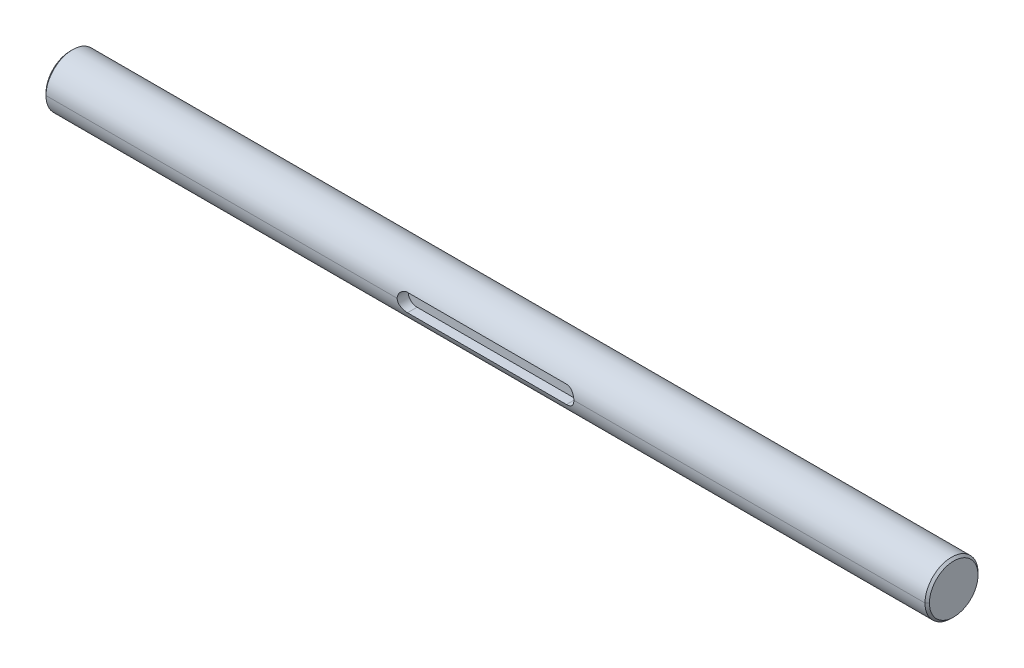
ISO-10303-21;
HEADER;
FILE_DESCRIPTION(('STEP AP214'),'2;1');
FILE_NAME('part.step','',(''),(''),'','','');
FILE_SCHEMA(('AUTOMOTIVE_DESIGN { 1 0 10303 214 1 1 1 1 }'));
ENDSEC;
DATA;
#1=APPLICATION_CONTEXT('core data for automotive mechanical design processes');
#2=APPLICATION_PROTOCOL_DEFINITION('international standard','automotive_design',2000,#1);
#3=PRODUCT_CONTEXT('',#1,'mechanical');
#4=PRODUCT('Part','Part','',(#3));
#5=PRODUCT_RELATED_PRODUCT_CATEGORY('part','',(#4));
#6=PRODUCT_DEFINITION_FORMATION('','',#4);
#7=PRODUCT_DEFINITION_CONTEXT('part definition',#1,'design');
#8=PRODUCT_DEFINITION('design','',#6,#7);
#9=PRODUCT_DEFINITION_SHAPE('','',#8);
#10=(LENGTH_UNIT() NAMED_UNIT(*) SI_UNIT(.MILLI.,.METRE.));
#11=(NAMED_UNIT(*) PLANE_ANGLE_UNIT() SI_UNIT($,.RADIAN.));
#12=(NAMED_UNIT(*) SI_UNIT($,.STERADIAN.) SOLID_ANGLE_UNIT());
#13=UNCERTAINTY_MEASURE_WITH_UNIT(LENGTH_MEASURE(1.E-05),#10,'distance_accuracy_value','');
#14=(GEOMETRIC_REPRESENTATION_CONTEXT(3) GLOBAL_UNCERTAINTY_ASSIGNED_CONTEXT((#13)) GLOBAL_UNIT_ASSIGNED_CONTEXT((#10,
#11,#12)) REPRESENTATION_CONTEXT('',''));
#15=CARTESIAN_POINT('',(0.,0.,0.));
#16=DIRECTION('',(0.,0.,1.));
#17=DIRECTION('',(1.,0.,0.));
#18=AXIS2_PLACEMENT_3D('',#15,#16,#17);
#19=CARTESIAN_POINT('',(0.,0.,0.));
#20=DIRECTION('',(1.,0.,0.));
#21=DIRECTION('',(0.,0.,-1.));
#22=AXIS2_PLACEMENT_3D('',#19,#20,#21);
#23=PLANE('',#22);
#24=CARTESIAN_POINT('',(0.,0.,0.));
#25=DIRECTION('',(1.,0.,0.));
#26=DIRECTION('',(0.,0.,-1.));
#27=AXIS2_PLACEMENT_3D('',#24,#25,#26);
#28=CIRCLE('',#27,5.5);
#29=CARTESIAN_POINT('',(0.,0.,5.5));
#30=VERTEX_POINT('',#29);
#31=CARTESIAN_POINT('',(0.,0.,-5.5));
#32=VERTEX_POINT('',#31);
#33=EDGE_CURVE('E11',#30,#32,#28,.T.);
#34=ORIENTED_EDGE('',*,*,#33,.F.);
#35=CARTESIAN_POINT('',(0.,0.,0.));
#36=DIRECTION('',(1.,0.,0.));
#37=DIRECTION('',(0.,0.,-1.));
#38=AXIS2_PLACEMENT_3D('',#35,#36,#37);
#39=CIRCLE('',#38,5.5);
#40=EDGE_CURVE('E24',#32,#30,#39,.T.);
#41=ORIENTED_EDGE('',*,*,#40,.F.);
#42=EDGE_LOOP('',(#34,#41));
#43=FACE_BOUND('',#42,.T.);
#44=ADVANCED_FACE('F16',(#43),#23,.F.);
#45=CARTESIAN_POINT('',(0.,0.,0.));
#46=DIRECTION('',(1.,0.,0.));
#47=DIRECTION('',(0.,-1.,0.));
#48=AXIS2_PLACEMENT_3D('',#45,#46,#47);
#49=CONICAL_SURFACE('',#48,5.5,0.785398163397448);
#50=DIRECTION('',(0.707106781186548,0.,0.707106781186548));
#51=VECTOR('',#50,1.);
#52=CARTESIAN_POINT('',(0.,0.,5.5));
#53=LINE('',#52,#51);
#54=CARTESIAN_POINT('',(0.499999999999999,0.,6.));
#55=VERTEX_POINT('',#54);
#56=EDGE_CURVE('E305',#30,#55,#53,.T.);
#57=ORIENTED_EDGE('',*,*,#56,.T.);
#58=CARTESIAN_POINT('',(0.5,0.,0.));
#59=DIRECTION('',(1.,0.,0.));
#60=DIRECTION('',(0.,0.,-1.));
#61=AXIS2_PLACEMENT_3D('',#58,#59,#60);
#62=CIRCLE('',#61,6.);
#63=CARTESIAN_POINT('',(0.5,0.,-6.));
#64=VERTEX_POINT('',#63);
#65=EDGE_CURVE('E300',#64,#55,#62,.T.);
#66=ORIENTED_EDGE('',*,*,#65,.F.);
#67=DIRECTION('',(0.707106781186548,0.,-0.707106781186548));
#68=VECTOR('',#67,1.);
#69=CARTESIAN_POINT('',(0.,0.,-5.5));
#70=LINE('',#69,#68);
#71=EDGE_CURVE('E295',#32,#64,#70,.T.);
#72=ORIENTED_EDGE('',*,*,#71,.F.);
#73=ORIENTED_EDGE('',*,*,#40,.T.);
#74=EDGE_LOOP('',(#57,#66,#72,#73));
#75=FACE_BOUND('',#74,.T.);
#76=ADVANCED_FACE('F314',(#75),#49,.T.);
#77=CARTESIAN_POINT('',(0.,0.,0.));
#78=DIRECTION('',(1.,0.,0.));
#79=DIRECTION('',(0.,1.,0.));
#80=AXIS2_PLACEMENT_3D('',#77,#78,#79);
#81=CONICAL_SURFACE('',#80,5.5,0.785398163397448);
#82=ORIENTED_EDGE('',*,*,#56,.F.);
#83=ORIENTED_EDGE('',*,*,#33,.T.);
#84=ORIENTED_EDGE('',*,*,#71,.T.);
#85=CARTESIAN_POINT('',(0.5,0.,0.));
#86=DIRECTION('',(1.,0.,0.));
#87=DIRECTION('',(0.,0.,-1.));
#88=AXIS2_PLACEMENT_3D('',#85,#86,#87);
#89=CIRCLE('',#88,6.);
#90=EDGE_CURVE('E290',#55,#64,#89,.T.);
#91=ORIENTED_EDGE('',*,*,#90,.F.);
#92=EDGE_LOOP('',(#82,#83,#84,#91));
#93=FACE_BOUND('',#92,.T.);
#94=ADVANCED_FACE('F259',(#93),#81,.T.);
#95=CARTESIAN_POINT('',(200.,0.,0.));
#96=DIRECTION('',(1.,0.,0.));
#97=DIRECTION('',(0.,1.,0.));
#98=AXIS2_PLACEMENT_3D('',#95,#96,#97);
#99=CYLINDRICAL_SURFACE('',#98,6.);
#100=DIRECTION('',(1.,0.,0.));
#101=VECTOR('',#100,1.);
#102=CARTESIAN_POINT('',(0.5,0.,6.));
#103=LINE('',#102,#101);
#104=CARTESIAN_POINT('',(80.,0.,6.));
#105=VERTEX_POINT('',#104);
#106=EDGE_CURVE('E286',#55,#105,#103,.T.);
#107=ORIENTED_EDGE('',*,*,#106,.F.);
#108=ORIENTED_EDGE('',*,*,#90,.T.);
#109=DIRECTION('',(1.,0.,0.));
#110=VECTOR('',#109,1.);
#111=CARTESIAN_POINT('',(0.5,0.,-6.));
#112=LINE('',#111,#110);
#113=CARTESIAN_POINT('',(199.5,0.,-6.));
#114=VERTEX_POINT('',#113);
#115=EDGE_CURVE('E282',#64,#114,#112,.T.);
#116=ORIENTED_EDGE('',*,*,#115,.T.);
#117=CARTESIAN_POINT('',(199.5,0.,0.));
#118=DIRECTION('',(1.,0.,0.));
#119=DIRECTION('',(0.,0.,-1.));
#120=AXIS2_PLACEMENT_3D('',#117,#118,#119);
#121=CIRCLE('',#120,6.);
#122=CARTESIAN_POINT('',(199.5,0.,6.));
#123=VERTEX_POINT('',#122);
#124=EDGE_CURVE('E277',#123,#114,#121,.T.);
#125=ORIENTED_EDGE('',*,*,#124,.F.);
#126=DIRECTION('',(1.,0.,0.));
#127=VECTOR('',#126,1.);
#128=CARTESIAN_POINT('',(120.,0.,6.));
#129=LINE('',#128,#127);
#130=CARTESIAN_POINT('',(120.,0.,6.));
#131=VERTEX_POINT('',#130);
#132=EDGE_CURVE('E274',#131,#123,#129,.T.);
#133=ORIENTED_EDGE('',*,*,#132,.F.);
#134=CARTESIAN_POINT('',(120.,0.,6.));
#135=CARTESIAN_POINT('',(119.999968253045,-0.021996086984681,6.00000019406138));
#136=CARTESIAN_POINT('',(119.999597004001,-0.0439926003119525,5.99987904903604));
#137=CARTESIAN_POINT('',(119.998151499383,-0.0879158247158115,5.99939593622002));
#138=CARTESIAN_POINT('',(119.997078646651,-0.109842587530041,5.99903444896496));
#139=CARTESIAN_POINT('',(119.994209391745,-0.15359193122345,5.99807362991366));
#140=CARTESIAN_POINT('',(119.992414701351,-0.175414635846898,5.99747486086187));
#141=CARTESIAN_POINT('',(119.988087951587,-0.2190024254686,5.99604152017669));
#142=CARTESIAN_POINT('',(119.98555511037,-0.240767424551038,5.99520669854559));
#143=CARTESIAN_POINT('',(119.979766154403,-0.28423629765052,5.99330326281774));
#144=CARTESIAN_POINT('',(119.976508560406,-0.305939953376741,5.992234170634));
#145=CARTESIAN_POINT('',(119.969279225485,-0.34924944390591,5.98986609830002));
#146=CARTESIAN_POINT('',(119.965306402608,-0.370855078951131,5.98856676991013));
#147=CARTESIAN_POINT('',(119.956657337202,-0.413932056969811,5.98574361322807));
#148=CARTESIAN_POINT('',(119.951980418442,-0.435403249945511,5.98421956914252));
#149=CARTESIAN_POINT('',(119.941933453716,-0.478174992168527,5.98095384354174));
#150=CARTESIAN_POINT('',(119.936563138547,-0.499475471709251,5.97921207750706));
#151=CARTESIAN_POINT('',(119.925139771346,-0.5418696221945,5.9755192199927));
#152=CARTESIAN_POINT('',(119.919086856003,-0.562963333627397,5.97356817042519));
#153=CARTESIAN_POINT('',(119.906308707649,-0.604908028783437,5.96946647245961));
#154=CARTESIAN_POINT('',(119.899584013213,-0.625759192221435,5.96731598405138));
#155=CARTESIAN_POINT('',(119.885472514833,-0.667183025411076,5.9628265307171));
#156=CARTESIAN_POINT('',(119.878086645026,-0.6877560422453,5.96048783216022));
#157=CARTESIAN_POINT('',(119.862663835936,-0.728588475901108,5.95563436458078));
#158=CARTESIAN_POINT('',(119.854628215725,-0.748848433337304,5.95311995361871));
#159=CARTESIAN_POINT('',(119.837907717389,-0.789033339917637,5.94792704455391));
#160=CARTESIAN_POINT('',(119.829224050788,-0.808958832921381,5.94524885425012));
#161=CARTESIAN_POINT('',(119.811195209296,-0.848526211841774,5.93973088185065));
#162=CARTESIAN_POINT('',(119.801848954055,-0.86816756864869,5.93689083740265));
#163=CARTESIAN_POINT('',(119.782510285865,-0.907151365974487,5.93105939343359));
#164=CARTESIAN_POINT('',(119.772516741935,-0.926493205905014,5.92806773109484));
#165=CARTESIAN_POINT('',(119.75190175652,-0.964849864199263,5.92194582973337));
#166=CARTESIAN_POINT('',(119.741279517887,-0.983864226143471,5.91881541610101));
#167=CARTESIAN_POINT('',(119.719425870881,-1.02153832391536,5.91242968373687));
#168=CARTESIAN_POINT('',(119.708193995404,-1.04019777259376,5.90917426980461));
#169=CARTESIAN_POINT('',(119.685139683894,-1.07713468956648,5.90255309094598));
#170=CARTESIAN_POINT('',(119.673317103477,-1.09541206290845,5.89918729911031));
#171=CARTESIAN_POINT('',(119.649100022137,-1.13155779544967,5.89236074387341));
#172=CARTESIAN_POINT('',(119.636705690067,-1.14942627310471,5.88890000863253));
#173=CARTESIAN_POINT('',(119.61136378111,-1.18472752823708,5.88189971066914));
#174=CARTESIAN_POINT('',(119.598416674676,-1.20216065696055,5.87836021615857));
#175=CARTESIAN_POINT('',(119.571987772723,-1.23656473400836,5.87121928559417));
#176=CARTESIAN_POINT('',(119.558506735747,-1.25353628404767,5.86761794125935));
#177=CARTESIAN_POINT('',(119.53102903722,-1.28699148549712,5.8603707462056));
#178=CARTESIAN_POINT('',(119.517033405725,-1.30347600391884,5.85672499322446));
#179=CARTESIAN_POINT('',(119.488527984373,-1.33594806282623,5.84940334180895));
#180=CARTESIAN_POINT('',(119.474018894218,-1.35193622782446,5.84572748927569));
#181=CARTESIAN_POINT('',(119.44445512904,-1.38345642701076,5.83834829895129));
#182=CARTESIAN_POINT('',(119.429399401333,-1.39898746407929,5.83464492038584));
#183=CARTESIAN_POINT('',(119.398762957934,-1.4295785904639,5.82722517303779));
#184=CARTESIAN_POINT('',(119.383181325675,-1.44463775889886,5.82350879289353));
#185=CARTESIAN_POINT('',(119.351516794086,-1.4742637709881,5.81607942401657));
#186=CARTESIAN_POINT('',(119.335433266662,-1.48882994596181,5.81236644605231));
#187=CARTESIAN_POINT('',(119.302789071039,-1.5174491678448,5.80496052231764));
#188=CARTESIAN_POINT('',(119.286228046535,-1.53150181285277,5.80126759408485));
#189=CARTESIAN_POINT('',(119.252652894867,-1.55907330442382,5.79391871077813));
#190=CARTESIAN_POINT('',(119.235638664279,-1.57259202736389,5.79026276441098));
#191=CARTESIAN_POINT('',(119.201181185341,-1.59907523902238,5.78300500019858));
#192=CARTESIAN_POINT('',(119.18373806625,-1.61203989157939,5.77940316655938));
#193=CARTESIAN_POINT('',(119.148446905286,-1.63739470509447,5.77227094596872));
#194=CARTESIAN_POINT('',(119.130599203722,-1.64978532400595,5.7687405033757));
#195=CARTESIAN_POINT('',(119.094523002489,-1.67397200677218,5.76176847092267));
#196=CARTESIAN_POINT('',(119.076295031044,-1.68576882658607,5.75832677095708));
#197=CARTESIAN_POINT('',(119.039482410962,-1.70874791352696,5.75154968804599));
#198=CARTESIAN_POINT('',(119.020898453785,-1.71993123557867,5.74821412702409));
#199=CARTESIAN_POINT('',(118.983393320343,-1.74166652603358,5.741665808702));
#200=CARTESIAN_POINT('',(118.964472877087,-1.75221968988489,5.73845282334171));
#201=CARTESIAN_POINT('',(118.926243389176,-1.77271208885923,5.73215552825408));
#202=CARTESIAN_POINT('',(118.906933796093,-1.78265036356565,5.72907142215054));
#203=CARTESIAN_POINT('',(118.867935246713,-1.80191628249886,5.72304113232309));
#204=CARTESIAN_POINT('',(118.848245523582,-1.8112424777215,5.72009528027719));
#205=CARTESIAN_POINT('',(118.808519829644,-1.82927025908199,5.7143556034972));
#206=CARTESIAN_POINT('',(118.788483333307,-1.83797077094606,5.71156204213982));
#207=CARTESIAN_POINT('',(118.748097558343,-1.85473361889306,5.70614062912227));
#208=CARTESIAN_POINT('',(118.727747968427,-1.86279526326132,5.70351295768369));
#209=CARTESIAN_POINT('',(118.68676941229,-1.87826664953863,5.69843668983768));
#210=CARTESIAN_POINT('',(118.666140320388,-1.88567608613836,5.69598817738712));
#211=CARTESIAN_POINT('',(118.624636215882,-1.89982928595832,5.69128318487645));
#212=CARTESIAN_POINT('',(118.603761234009,-1.90657313139522,5.68902668110337));
#213=CARTESIAN_POINT('',(118.561798833165,-1.91938129434047,5.68471820491434));
#214=CARTESIAN_POINT('',(118.54071157146,-1.92544607958336,5.68266609182368));
#215=CARTESIAN_POINT('',(118.498358103282,-1.93688207198481,5.67877841359258));
#216=CARTESIAN_POINT('',(118.477092150148,-1.94225412699015,5.67694258398082));
#217=CARTESIAN_POINT('',(118.434414902068,-1.95229074520107,5.67349882763699));
#218=CARTESIAN_POINT('',(118.413003925411,-1.9569565263484,5.67189050889249));
#219=CARTESIAN_POINT('',(118.370069959399,-1.96556545253364,5.66891287205406));
#220=CARTESIAN_POINT('',(118.348547322574,-1.9695101731959,5.66754303316583));
#221=CARTESIAN_POINT('',(118.305394819485,-1.9766705042753,5.66504970021555));
#222=CARTESIAN_POINT('',(118.283765121502,-1.97988702265984,5.66392589943634));
#223=CARTESIAN_POINT('',(118.240381760642,-1.98561452936158,5.66192053431376));
#224=CARTESIAN_POINT('',(118.218628004244,-1.98812488448846,5.66103918738527));
#225=CARTESIAN_POINT('',(118.175033669646,-1.99243325871761,5.65952426451671));
#226=CARTESIAN_POINT('',(118.153193063537,-1.99423102633772,5.65889077605039));
#227=CARTESIAN_POINT('',(118.109464428618,-1.99711097128919,5.65787506308906));
#228=CARTESIAN_POINT('',(118.087576413254,-1.99819333019126,5.65749277483959));
#229=CARTESIAN_POINT('',(118.043792321868,-1.99963738482623,5.65698244829405));
#230=CARTESIAN_POINT('',(118.021896268514,-1.99999969238851,5.6568541941449));
#231=CARTESIAN_POINT('',(118.,-2.,5.65685424949238));
#232=B_SPLINE_CURVE_WITH_KNOTS('',3,(#134,#135,#136,#137,#138,#139,#140,#141,#142,#143,#144,
#145,#146,#147,#148,#149,#150,#151,#152,#153,#154,#155,#156,#157,#158,#159,#160,#161,#162,#163,
#164,#165,#166,#167,#168,#169,#170,#171,#172,#173,#174,#175,#176,#177,#178,#179,#180,#181,#182,
#183,#184,#185,#186,#187,#188,#189,#190,#191,#192,#193,#194,#195,#196,#197,#198,#199,#200,#201,
#202,#203,#204,#205,#206,#207,#208,#209,#210,#211,#212,#213,#214,#215,#216,#217,#218,#219,#220,
#221,#222,#223,#224,#225,#226,#227,#228,#229,#230,#231),.UNSPECIFIED.,.F.,.F.,(4,2,2,2,2,2,2,2,
2,2,2,2,2,2,2,2,2,2,2,2,2,2,2,2,2,2,2,2,2,2,2,2,2,2,2,2,2,2,2,2,2,2,2,2,2,2,2,2,4),(0.,
0.0659867363898243,0.1318419353305,0.197541876007778,0.263311660252542,0.329216935154128,
0.395222758291165,0.461292384366877,0.527387738729455,0.593469881129946,0.659499463560962,
0.725437186149896,0.791244255161297,0.856931239431298,0.922727905148782,0.988642809208486,
1.05464315867986,1.12069481194237,1.1867626895938,1.25281117887994,1.31880453478879,
1.38470728102521,1.45048461411463,1.51617552366828,1.58200045229605,1.64794671757024,
1.71397911101898,1.78006212208383,1.84616034520375,1.91223888590097,1.97826376910524,
2.04420235286107,2.11002375042618,2.17571603085511,2.24150845465781,2.30745139701827,
2.37350498360611,2.43962913744154,2.50578408228181,2.57193084512549,2.63803176229983,
2.70405099340967,2.76995504716913,2.83571332278802,2.9013891497552,2.96712367943418,
3.0328813871418,3.09862239913078,3.16430752689761),.UNSPECIFIED.);
#233=CARTESIAN_POINT('',(118.,-2.,5.65685424949238));
#234=VERTEX_POINT('',#233);
#235=EDGE_CURVE('E141',#131,#234,#232,.T.);
#236=ORIENTED_EDGE('',*,*,#235,.T.);
#237=DIRECTION('',(-1.,0.,0.));
#238=VECTOR('',#237,1.);
#239=CARTESIAN_POINT('',(200.,-2.,5.65685424949238));
#240=LINE('',#239,#238);
#241=CARTESIAN_POINT('',(82.,-2.,5.65685424949238));
#242=VERTEX_POINT('',#241);
#243=EDGE_CURVE('E103',#234,#242,#240,.T.);
#244=ORIENTED_EDGE('',*,*,#243,.T.);
#245=CARTESIAN_POINT('',(82.,-2.,5.65685424949238));
#246=CARTESIAN_POINT('',(81.9737164223698,-1.99999927385355,5.65685416195585));
#247=CARTESIAN_POINT('',(81.9474338571261,-1.99946412266909,5.6570437022898));
#248=CARTESIAN_POINT('',(81.8948473530583,-1.99734299883385,5.65779314315031));
#249=CARTESIAN_POINT('',(81.8685435384531,-1.99575427847302,5.65835401209613));
#250=CARTESIAN_POINT('',(81.8159805862964,-1.99154035841683,5.65983848836918));
#251=CARTESIAN_POINT('',(81.7897216219028,-1.98891324318645,5.66076276606266));
#252=CARTESIAN_POINT('',(81.7373137914163,-1.98263517525259,5.66296467502997));
#253=CARTESIAN_POINT('',(81.7111650671809,-1.97898316707582,5.66424267055693));
#254=CARTESIAN_POINT('',(81.6590434187385,-1.9706676676539,5.66714110565114));
#255=CARTESIAN_POINT('',(81.6330705261948,-1.96600399897843,5.66876160528728));
#256=CARTESIAN_POINT('',(81.581366240954,-1.95567700581416,5.6723326142601));
#257=CARTESIAN_POINT('',(81.555634690822,-1.95001438882694,5.67428288999374));
#258=CARTESIAN_POINT('',(81.5044790035138,-1.93770067550682,5.67849965785329));
#259=CARTESIAN_POINT('',(81.4790544416626,-1.93105116936919,5.68076564092003));
#260=CARTESIAN_POINT('',(81.4285782749139,-1.91677527734816,5.68559840551418));
#261=CARTESIAN_POINT('',(81.4035259025075,-1.90915135071726,5.68816442845534));
#262=CARTESIAN_POINT('',(81.3538170365889,-1.89292034814765,5.6935863506314));
#263=CARTESIAN_POINT('',(81.3291599891198,-1.88431481609327,5.6964417938943));
#264=CARTESIAN_POINT('',(81.2801789882244,-1.86612483345061,5.70242667783264));
#265=CARTESIAN_POINT('',(81.2558559232462,-1.85653819394135,5.70555672885661));
#266=CARTESIAN_POINT('',(81.2075869654499,-1.83641327146504,5.71206603047855));
#267=CARTESIAN_POINT('',(81.1836418578806,-1.82587325246823,5.71544573353567));
#268=CARTESIAN_POINT('',(81.1361787239926,-1.80387037390526,5.72242824754044));
#269=CARTESIAN_POINT('',(81.1126612207991,-1.7924064664259,5.72603131073287));
#270=CARTESIAN_POINT('',(81.0661032539337,-1.76858458956796,5.73343389053866));
#271=CARTESIAN_POINT('',(81.0430629814193,-1.75622627050677,5.73723348382073));
#272=CARTESIAN_POINT('',(80.9975094606005,-1.7306445067071,5.74500202077666));
#273=CARTESIAN_POINT('',(80.9749960049342,-1.71742141040704,5.74897089602148));
#274=CARTESIAN_POINT('',(80.9305463814183,-1.69013894213744,5.75705067722879));
#275=CARTESIAN_POINT('',(80.9086095440494,-1.67608060800609,5.76116140437323));
#276=CARTESIAN_POINT('',(80.8653626926877,-1.64715769980982,5.76949716963122));
#277=CARTESIAN_POINT('',(80.8440514879727,-1.63229483427708,5.77372195663901));
#278=CARTESIAN_POINT('',(80.8020925938945,-1.60177815658355,5.78226228924984));
#279=CARTESIAN_POINT('',(80.7814435943464,-1.5861260870065,5.78657762358693));
#280=CARTESIAN_POINT('',(80.7407500535482,-1.55399661609172,5.79528878085524));
#281=CARTESIAN_POINT('',(80.720706738853,-1.53751769915728,5.79968474146859));
#282=CARTESIAN_POINT('',(80.6812426748124,-1.5037614102829,5.80852878947026));
#283=CARTESIAN_POINT('',(80.6618232921151,-1.48648246437997,5.81297696554197));
#284=CARTESIAN_POINT('',(80.623645515824,-1.45116266792598,5.821894803292));
#285=CARTESIAN_POINT('',(80.6048880459334,-1.43312082432988,5.82636448581549));
#286=CARTESIAN_POINT('',(80.5680719461839,-1.39631310201327,5.83529507260912));
#287=CARTESIAN_POINT('',(80.5500137465578,-1.37754679130176,5.83975596992122));
#288=CARTESIAN_POINT('',(80.5146342831224,-1.33932838482629,5.84863952635407));
#289=CARTESIAN_POINT('',(80.4973129121003,-1.31987638959189,5.85306219096277));
#290=CARTESIAN_POINT('',(80.4634451047729,-1.28032561278354,5.86184069156958));
#291=CARTESIAN_POINT('',(80.4468979847756,-1.2602274293311,5.86619658415332));
#292=CARTESIAN_POINT('',(80.4146170959854,-1.21942370595931,5.87481403029118));
#293=CARTESIAN_POINT('',(80.3988820326912,-1.19871922069508,5.87907572738453));
#294=CARTESIAN_POINT('',(80.3682623476939,-1.15674380968928,5.88747831000735));
#295=CARTESIAN_POINT('',(80.3533757955084,-1.13547434554943,5.89161945835294));
#296=CARTESIAN_POINT('',(80.3244530539626,-1.09234458284806,5.89976819630074));
#297=CARTESIAN_POINT('',(80.3104167371496,-1.07048437355487,5.90377580588006));
#298=CARTESIAN_POINT('',(80.2831684900498,-1.02614547604453,5.9116439191084));
#299=CARTESIAN_POINT('',(80.2699589366001,-1.00366525032555,5.91550398722851));
#300=CARTESIAN_POINT('',(80.2443905299775,-0.958138384202285,5.92304856372179));
#301=CARTESIAN_POINT('',(80.2320333881721,-0.935090723564702,5.92673271459539));
#302=CARTESIAN_POINT('',(80.208198220097,-0.888480982364552,5.93389906596488));
#303=CARTESIAN_POINT('',(80.1967212022209,-0.86491835033761,5.93738103373473));
#304=CARTESIAN_POINT('',(80.1746742265075,-0.817331736768878,5.94411864620824));
#305=CARTESIAN_POINT('',(80.1641045476126,-0.793307616110124,5.94737422125417));
#306=CARTESIAN_POINT('',(80.1439003460673,-0.744851768428712,5.95363689998716));
#307=CARTESIAN_POINT('',(80.1342653542315,-0.720420253199766,5.95664412822308));
#308=CARTESIAN_POINT('',(80.1159586564521,-0.671204061497792,5.96239030279442));
#309=CARTESIAN_POINT('',(80.1072857217539,-0.646419882212665,5.96512959080586));
#310=CARTESIAN_POINT('',(80.0909311084549,-0.596553531902419,5.97032252021476));
#311=CARTESIAN_POINT('',(80.0832474390351,-0.571472073906211,5.97277673429535));
#312=CARTESIAN_POINT('',(80.06889921969,-0.521063848111754,5.97738499111939));
#313=CARTESIAN_POINT('',(80.0622320325682,-0.495737902844466,5.97953980929038));
#314=CARTESIAN_POINT('',(80.0499163968569,-0.444785767222723,5.98354571354468));
#315=CARTESIAN_POINT('',(80.0442690877831,-0.419159274681927,5.98539645968072));
#316=CARTESIAN_POINT('',(80.0339776960106,-0.367614817762772,5.98878353446967));
#317=CARTESIAN_POINT('',(80.0293362944706,-0.341696263521876,5.99031902226978));
#318=CARTESIAN_POINT('',(80.0210630660305,-0.289633808819865,5.99306206746484));
#319=CARTESIAN_POINT('',(80.017433055718,-0.263489588735824,5.99426903470631));
#320=CARTESIAN_POINT('',(80.0111883201598,-0.21104269771193,5.99634475733385));
#321=CARTESIAN_POINT('',(80.0085745226311,-0.184739904144886,5.99721320368065));
#322=CARTESIAN_POINT('',(80.0043678841833,-0.132043000892518,5.99860475888697));
#323=CARTESIAN_POINT('',(80.0027750684671,-0.105648888969187,5.9991278592217));
#324=CARTESIAN_POINT('',(80.0006170148701,-0.0528368917899854,5.99982552245617));
#325=CARTESIAN_POINT('',(80.0000508933932,-0.0264190465716597,6.00000038506989));
#326=CARTESIAN_POINT('',(80.,0.,6.));
#327=B_SPLINE_CURVE_WITH_KNOTS('',3,(#245,#246,#247,#248,#249,#250,#251,#252,#253,#254,#255,
#256,#257,#258,#259,#260,#261,#262,#263,#264,#265,#266,#267,#268,#269,#270,#271,#272,#273,#274,
#275,#276,#277,#278,#279,#280,#281,#282,#283,#284,#285,#286,#287,#288,#289,#290,#291,#292,#293,
#294,#295,#296,#297,#298,#299,#300,#301,#302,#303,#304,#305,#306,#307,#308,#309,#310,#311,#312,
#313,#314,#315,#316,#317,#318,#319,#320,#321,#322,#323,#324,#325,#326),.UNSPECIFIED.,.F.,.F.,(4,
2,2,2,2,2,2,2,2,2,2,2,2,2,2,2,2,2,2,2,2,2,2,2,2,2,2,2,2,2,2,2,2,2,2,2,2,2,2,2,4),(0.,
0.078843169551474,0.15789277514575,0.237088889869175,0.316366864922985,0.395658755420733,
0.474894711544492,0.554004352059732,0.632918138027311,0.711709475443247,0.790680601475497,
0.869798539559774,0.949007514842787,1.02824762702806,1.10745600596626,1.18656794214632,
1.26551800472878,1.34430078773673,1.42323366649982,1.50232904712092,1.58153076032162,
1.66078045298942,1.74001857463789,1.81918535202929,1.89822176283647,1.97707051931307,
2.0559074267442,2.13496145260066,2.21416983293206,2.29346765010698,2.37278975908589,
2.45207184240539,2.53125147024342,2.61026917817185,2.68907825731305,2.76797485276978,
2.84707922212682,2.92632477031165,3.00564249409987,3.08496217575416,3.16421356064536),.UNSPECIFIED.);
#328=EDGE_CURVE('E225',#242,#105,#327,.T.);
#329=ORIENTED_EDGE('',*,*,#328,.T.);
#330=EDGE_LOOP('',(#107,#108,#116,#125,#133,#236,#244,#329));
#331=FACE_BOUND('',#330,.T.);
#332=ADVANCED_FACE('F250',(#331),#99,.T.);
#333=CARTESIAN_POINT('',(82.,0.,3.5));
#334=DIRECTION('',(0.,0.,1.));
#335=DIRECTION('',(1.,0.,0.));
#336=AXIS2_PLACEMENT_3D('',#333,#334,#335);
#337=CYLINDRICAL_SURFACE('',#336,2.);
#338=DIRECTION('',(0.,0.,1.));
#339=VECTOR('',#338,1.);
#340=CARTESIAN_POINT('',(82.,-2.,3.5));
#341=LINE('',#340,#339);
#342=CARTESIAN_POINT('',(82.,-2.,3.5));
#343=VERTEX_POINT('',#342);
#344=EDGE_CURVE('E240',#343,#242,#341,.T.);
#345=ORIENTED_EDGE('',*,*,#344,.F.);
#346=CARTESIAN_POINT('',(82.,0.,3.5));
#347=DIRECTION('',(0.,0.,1.));
#348=DIRECTION('',(1.,0.,0.));
#349=AXIS2_PLACEMENT_3D('',#346,#347,#348);
#350=CIRCLE('',#349,2.);
#351=CARTESIAN_POINT('',(82.,2.,3.5));
#352=VERTEX_POINT('',#351);
#353=EDGE_CURVE('E106',#352,#343,#350,.T.);
#354=ORIENTED_EDGE('',*,*,#353,.F.);
#355=DIRECTION('',(0.,0.,1.));
#356=VECTOR('',#355,1.);
#357=CARTESIAN_POINT('',(82.,2.,3.5));
#358=LINE('',#357,#356);
#359=CARTESIAN_POINT('',(82.,2.,5.65685424949238));
#360=VERTEX_POINT('',#359);
#361=EDGE_CURVE('E235',#352,#360,#358,.T.);
#362=ORIENTED_EDGE('',*,*,#361,.T.);
#363=CARTESIAN_POINT('',(80.,0.,6.));
#364=CARTESIAN_POINT('',(80.0000317469551,0.0219960869843168,6.00000019406138));
#365=CARTESIAN_POINT('',(80.000402995999,0.0439926003112219,5.99987904903604));
#366=CARTESIAN_POINT('',(80.0018485006174,0.0879158247146077,5.99939593622004));
#367=CARTESIAN_POINT('',(80.0029213533488,0.109842587528729,5.99903444896498));
#368=CARTESIAN_POINT('',(80.0057906082553,0.153591931222033,5.9980736299137));
#369=CARTESIAN_POINT('',(80.0075852986486,0.175414635845483,5.99747486086191));
#370=CARTESIAN_POINT('',(80.0119120484131,0.219002425467196,5.99604152017674));
#371=CARTESIAN_POINT('',(80.0144448896301,0.240767424549645,5.99520669854564));
#372=CARTESIAN_POINT('',(80.0202338455965,0.284236297649152,5.99330326281781));
#373=CARTESIAN_POINT('',(80.023491439594,0.305939953375386,5.99223417063407));
#374=CARTESIAN_POINT('',(80.0307207745147,0.349249443904581,5.9898660983001));
#375=CARTESIAN_POINT('',(80.0346935973921,0.370855078949814,5.98856676991022));
#376=CARTESIAN_POINT('',(80.0433426627977,0.413932056968521,5.98574361322816));
#377=CARTESIAN_POINT('',(80.0480195815575,0.435403249944235,5.98421956914261));
#378=CARTESIAN_POINT('',(80.0580665462835,0.478174992167283,5.98095384354184));
#379=CARTESIAN_POINT('',(80.0634368614523,0.499475471708024,5.97921207750716));
#380=CARTESIAN_POINT('',(80.0748602286533,0.54186962219331,5.97551921999281));
#381=CARTESIAN_POINT('',(80.0809131439971,0.562963333626229,5.9735681704253));
#382=CARTESIAN_POINT('',(80.0936912923502,0.6049080287823,5.96946647245973));
#383=CARTESIAN_POINT('',(80.1004159867869,0.62575919222031,5.9673159840515));
#384=CARTESIAN_POINT('',(80.114527485167,0.66718302540998,5.96282653071723));
#385=CARTESIAN_POINT('',(80.1219133549736,0.687756042244221,5.96048783216034));
#386=CARTESIAN_POINT('',(80.137336164064,0.728588475900067,5.95563436458091));
#387=CARTESIAN_POINT('',(80.145371784275,0.748848433336283,5.95311995361884));
#388=CARTESIAN_POINT('',(80.1620922826105,0.789033339916646,5.94792704455404));
#389=CARTESIAN_POINT('',(80.1707759492115,0.8089588329204,5.94524885425025));
#390=CARTESIAN_POINT('',(80.188804790704,0.848526211840819,5.93973088185079));
#391=CARTESIAN_POINT('',(80.1981510459441,0.868167568647751,5.93689083740279));
#392=CARTESIAN_POINT('',(80.2174897141342,0.907151365973575,5.93105939343373));
#393=CARTESIAN_POINT('',(80.2274832580648,0.926493205904113,5.92806773109498));
#394=CARTESIAN_POINT('',(80.2480982434791,0.964849864198382,5.92194582973351));
#395=CARTESIAN_POINT('',(80.2587204821128,0.9838642261426,5.91881541610115));
#396=CARTESIAN_POINT('',(80.2805741291182,1.02153832391451,5.91242968373701));
#397=CARTESIAN_POINT('',(80.2918060045953,1.04019777259292,5.90917426980475));
#398=CARTESIAN_POINT('',(80.3148603161059,1.07713468956566,5.90255309094613));
#399=CARTESIAN_POINT('',(80.3266828965222,1.09541206290763,5.89918729911046));
#400=CARTESIAN_POINT('',(80.350899977863,1.13155779544887,5.89236074387357));
#401=CARTESIAN_POINT('',(80.3632943099327,1.14942627310393,5.88890000863268));
#402=CARTESIAN_POINT('',(80.3886362188891,1.18472752823632,5.88189971066929));
#403=CARTESIAN_POINT('',(80.4015833253235,1.2021606569598,5.87836021615873));
#404=CARTESIAN_POINT('',(80.4280122272762,1.23656473400763,5.87121928559433));
#405=CARTESIAN_POINT('',(80.4414932642525,1.25353628404696,5.8676179412595));
#406=CARTESIAN_POINT('',(80.4689709627794,1.28699148549643,5.86037074620575));
#407=CARTESIAN_POINT('',(80.4829665942742,1.30347600391815,5.85672499322462));
#408=CARTESIAN_POINT('',(80.5114720156266,1.33594806282557,5.84940334180911));
#409=CARTESIAN_POINT('',(80.5259811057814,1.35193622782381,5.84572748927584));
#410=CARTESIAN_POINT('',(80.5555448709595,1.38345642701014,5.83834829895144));
#411=CARTESIAN_POINT('',(80.5706005986661,1.39898746407868,5.83464492038598));
#412=CARTESIAN_POINT('',(80.6012370420658,1.42957859046333,5.82722517303794));
#413=CARTESIAN_POINT('',(80.6168186743247,1.44463775889829,5.82350879289367));
#414=CARTESIAN_POINT('',(80.6484832059132,1.47426377098756,5.8160794240167));
#415=CARTESIAN_POINT('',(80.6645667333374,1.48882994596129,5.81236644605244));
#416=CARTESIAN_POINT('',(80.6972109289608,1.51744916784431,5.80496052231777));
#417=CARTESIAN_POINT('',(80.7137719534649,1.53150181285229,5.80126759408497));
#418=CARTESIAN_POINT('',(80.7473471051321,1.55907330442336,5.79391871077825));
#419=CARTESIAN_POINT('',(80.7643613357201,1.57259202736345,5.7902627644111));
#420=CARTESIAN_POINT('',(80.7988188146586,1.59907523902196,5.7830050001987));
#421=CARTESIAN_POINT('',(80.8162619337495,1.61203989157898,5.77940316655949));
#422=CARTESIAN_POINT('',(80.8515530947138,1.63739470509408,5.77227094596883));
#423=CARTESIAN_POINT('',(80.8694007962777,1.64978532400557,5.76874050337581));
#424=CARTESIAN_POINT('',(80.9054769975102,1.67397200677183,5.76176847092277));
#425=CARTESIAN_POINT('',(80.9237049689557,1.68576882658573,5.75832677095718));
#426=CARTESIAN_POINT('',(80.9605175890377,1.70874791352665,5.75154968804609));
#427=CARTESIAN_POINT('',(80.9791015462147,1.71993123557836,5.74821412702419));
#428=CARTESIAN_POINT('',(81.0166066796567,1.74166652603329,5.74166580870209));
#429=CARTESIAN_POINT('',(81.0355271229122,1.75221968988461,5.73845282334179));
#430=CARTESIAN_POINT('',(81.0737566108237,1.77271208885898,5.73215552825416));
#431=CARTESIAN_POINT('',(81.0930662039067,1.78265036356539,5.72907142215062));
#432=CARTESIAN_POINT('',(81.1320647532867,1.80191628249863,5.72304113232317));
#433=CARTESIAN_POINT('',(81.1517544764178,1.81124247772129,5.72009528027725));
#434=CARTESIAN_POINT('',(81.1914801703561,1.8292702590818,5.71435560349726));
#435=CARTESIAN_POINT('',(81.2115166666927,1.83797077094587,5.71156204213988));
#436=CARTESIAN_POINT('',(81.2519024416572,1.85473361889289,5.70614062912233));
#437=CARTESIAN_POINT('',(81.2722520315725,1.86279526326118,5.70351295768374));
#438=CARTESIAN_POINT('',(81.3132305877098,1.8782666495385,5.69843668983773));
#439=CARTESIAN_POINT('',(81.3338596796121,1.88567608613824,5.69598817738716));
#440=CARTESIAN_POINT('',(81.3753637841182,1.89982928595821,5.69128318487648));
#441=CARTESIAN_POINT('',(81.3962387659912,1.90657313139512,5.6890266811034));
#442=CARTESIAN_POINT('',(81.4382011668347,1.91938129434039,5.68471820491436));
#443=CARTESIAN_POINT('',(81.4592884285394,1.92544607958329,5.6826660918237));
#444=CARTESIAN_POINT('',(81.5016418967174,1.93688207198476,5.6787784135926));
#445=CARTESIAN_POINT('',(81.5229078498513,1.94225412699011,5.67694258398083));
#446=CARTESIAN_POINT('',(81.5655850979317,1.95229074520104,5.673498827637));
#447=CARTESIAN_POINT('',(81.5869960745886,1.95695652634838,5.6718905088925));
#448=CARTESIAN_POINT('',(81.6299300406006,1.96556545253363,5.66891287205407));
#449=CARTESIAN_POINT('',(81.6514526774261,1.96951017319589,5.66754303316584));
#450=CARTESIAN_POINT('',(81.6946051805151,1.9766705042753,5.66504970021555));
#451=CARTESIAN_POINT('',(81.7162348784982,1.97988702265984,5.66392589943634));
#452=CARTESIAN_POINT('',(81.7596182393575,1.98561452936159,5.66192053431376));
#453=CARTESIAN_POINT('',(81.7813719957562,1.98812488448847,5.66103918738527));
#454=CARTESIAN_POINT('',(81.8249663303543,1.99243325871761,5.6595242645167));
#455=CARTESIAN_POINT('',(81.8468069364625,1.99423102633773,5.65889077605038));
#456=CARTESIAN_POINT('',(81.8905355713823,1.99711097128921,5.65787506308906));
#457=CARTESIAN_POINT('',(81.9124235867455,1.99819333019127,5.65749277483959));
#458=CARTESIAN_POINT('',(81.9562076781317,1.99963738482624,5.65698244829405));
#459=CARTESIAN_POINT('',(81.978103731486,1.99999969238852,5.6568541941449));
#460=CARTESIAN_POINT('',(82.,2.00000000000001,5.65685424949238));
#461=B_SPLINE_CURVE_WITH_KNOTS('',3,(#363,#364,#365,#366,#367,#368,#369,#370,#371,#372,#373,
#374,#375,#376,#377,#378,#379,#380,#381,#382,#383,#384,#385,#386,#387,#388,#389,#390,#391,#392,
#393,#394,#395,#396,#397,#398,#399,#400,#401,#402,#403,#404,#405,#406,#407,#408,#409,#410,#411,
#412,#413,#414,#415,#416,#417,#418,#419,#420,#421,#422,#423,#424,#425,#426,#427,#428,#429,#430,
#431,#432,#433,#434,#435,#436,#437,#438,#439,#440,#441,#442,#443,#444,#445,#446,#447,#448,#449,
#450,#451,#452,#453,#454,#455,#456,#457,#458,#459,#460),.UNSPECIFIED.,.F.,.F.,(4,2,2,2,2,2,2,2,
2,2,2,2,2,2,2,2,2,2,2,2,2,2,2,2,2,2,2,2,2,2,2,2,2,2,2,2,2,2,2,2,2,2,2,2,2,2,2,2,4),(0.,
0.0659867363887274,0.131841935329081,0.197541876006357,0.263311660251148,0.329216935152765,
0.395222758289816,0.461292384365571,0.527387738728179,0.593469881128704,0.659499463559753,
0.725437186148706,0.791244255160141,0.85693123943019,0.922727905147677,0.988642809207414,
1.05464315867883,1.12069481194139,1.18676268959284,1.252811178879,1.31880453478788,
1.38470728102432,1.4504846141138,1.51617552366746,1.58200045229526,1.64794671756952,
1.71397911101826,1.78006212208314,1.8461603452031,1.91223888590036,1.97826376910466,
2.04420235286051,2.11002375042566,2.17571603085458,2.24150845465735,2.30745139701784,
2.37350498360574,2.43962913744116,2.50578408228147,2.57193084512517,2.63803176229957,
2.70405099340939,2.7699550471689,2.8357133227878,2.90138914975506,2.96712367943406,
3.0328813871417,3.09862239913073,3.16430752689761),.UNSPECIFIED.);
#462=EDGE_CURVE('E213',#105,#360,#461,.T.);
#463=ORIENTED_EDGE('',*,*,#462,.F.);
#464=ORIENTED_EDGE('',*,*,#328,.F.);
#465=EDGE_LOOP('',(#345,#354,#362,#463,#464));
#466=FACE_BOUND('',#465,.T.);
#467=ADVANCED_FACE('F193',(#466),#337,.F.);
#468=CARTESIAN_POINT('',(200.,0.,0.));
#469=DIRECTION('',(1.,0.,0.));
#470=DIRECTION('',(0.,-1.,0.));
#471=AXIS2_PLACEMENT_3D('',#468,#469,#470);
#472=CYLINDRICAL_SURFACE('',#471,6.);
#473=ORIENTED_EDGE('',*,*,#106,.T.);
#474=ORIENTED_EDGE('',*,*,#462,.T.);
#475=DIRECTION('',(1.,0.,0.));
#476=VECTOR('',#475,1.);
#477=CARTESIAN_POINT('',(200.,2.,5.65685424949238));
#478=LINE('',#477,#476);
#479=CARTESIAN_POINT('',(118.,2.,5.65685424949238));
#480=VERTEX_POINT('',#479);
#481=EDGE_CURVE('E456',#360,#480,#478,.T.);
#482=ORIENTED_EDGE('',*,*,#481,.T.);
#483=CARTESIAN_POINT('',(118.,2.00000000000001,5.65685424949238));
#484=CARTESIAN_POINT('',(118.02628357763,1.99999927385355,5.65685416195584));
#485=CARTESIAN_POINT('',(118.052566142874,1.9994641226691,5.6570437022898));
#486=CARTESIAN_POINT('',(118.105152646942,1.99734299883385,5.65779314315031));
#487=CARTESIAN_POINT('',(118.131456461547,1.99575427847302,5.65835401209612));
#488=CARTESIAN_POINT('',(118.184019413704,1.99154035841683,5.65983848836918));
#489=CARTESIAN_POINT('',(118.210278378097,1.98891324318645,5.66076276606266));
#490=CARTESIAN_POINT('',(118.262686208584,1.98263517525258,5.66296467502997));
#491=CARTESIAN_POINT('',(118.288834932819,1.97898316707581,5.66424267055693));
#492=CARTESIAN_POINT('',(118.340956581262,1.97066766765388,5.66714110565115));
#493=CARTESIAN_POINT('',(118.366929473805,1.96600399897841,5.66876160528729));
#494=CARTESIAN_POINT('',(118.418633759046,1.95567700581412,5.67233261426011));
#495=CARTESIAN_POINT('',(118.444365309178,1.9500143888269,5.67428288999375));
#496=CARTESIAN_POINT('',(118.495520996487,1.93770067550676,5.67849965785331));
#497=CARTESIAN_POINT('',(118.520945558338,1.93105116936912,5.68076564092005));
#498=CARTESIAN_POINT('',(118.571421725086,1.91677527734809,5.68559840551421));
#499=CARTESIAN_POINT('',(118.596474097493,1.90915135071718,5.68816442845536));
#500=CARTESIAN_POINT('',(118.646182963411,1.89292034814755,5.69358635063143));
#501=CARTESIAN_POINT('',(118.670840010881,1.88431481609317,5.69644179389433));
#502=CARTESIAN_POINT('',(118.719821011776,1.86612483345049,5.70242667783267));
#503=CARTESIAN_POINT('',(118.744144076754,1.85653819394122,5.70555672885665));
#504=CARTESIAN_POINT('',(118.79241303455,1.83641327146488,5.7120660304786));
#505=CARTESIAN_POINT('',(118.81635814212,1.82587325246806,5.71544573353573));
#506=CARTESIAN_POINT('',(118.863821276008,1.80387037390508,5.7224282475405));
#507=CARTESIAN_POINT('',(118.887338779201,1.79240646642571,5.72603131073292));
#508=CARTESIAN_POINT('',(118.933896746067,1.76858458956775,5.73343389053872));
#509=CARTESIAN_POINT('',(118.956937018581,1.75622627050654,5.7372334838208));
#510=CARTESIAN_POINT('',(119.0024905394,1.73064450670684,5.74500202077674));
#511=CARTESIAN_POINT('',(119.025003995066,1.71742141040676,5.74897089602156));
#512=CARTESIAN_POINT('',(119.069453618582,1.69013894213714,5.75705067722887));
#513=CARTESIAN_POINT('',(119.091390455951,1.67608060800579,5.76116140437332));
#514=CARTESIAN_POINT('',(119.134637307313,1.64715769980949,5.76949716963132));
#515=CARTESIAN_POINT('',(119.155948512028,1.63229483427674,5.77372195663911));
#516=CARTESIAN_POINT('',(119.197907406106,1.60177815658318,5.78226228924995));
#517=CARTESIAN_POINT('',(119.218556405654,1.58612608700611,5.78657762358704));
#518=CARTESIAN_POINT('',(119.259249946452,1.5539966160913,5.79528878085535));
#519=CARTESIAN_POINT('',(119.279293261148,1.53751769915684,5.79968474146871));
#520=CARTESIAN_POINT('',(119.318757325188,1.50376141028243,5.80852878947038));
#521=CARTESIAN_POINT('',(119.338176707885,1.48648246437949,5.8129769655421));
#522=CARTESIAN_POINT('',(119.376354484177,1.45116266792547,5.82189480329213));
#523=CARTESIAN_POINT('',(119.395111954067,1.43312082432936,5.82636448581562));
#524=CARTESIAN_POINT('',(119.431928053817,1.3963131020127,5.83529507260925));
#525=CARTESIAN_POINT('',(119.449986253443,1.37754679130118,5.83975596992135));
#526=CARTESIAN_POINT('',(119.485365716878,1.33932838482568,5.84863952635421));
#527=CARTESIAN_POINT('',(119.5026870879,1.31987638959127,5.85306219096291));
#528=CARTESIAN_POINT('',(119.536554895228,1.28032561278288,5.86184069156972));
#529=CARTESIAN_POINT('',(119.553102015225,1.26022742933042,5.86619658415347));
#530=CARTESIAN_POINT('',(119.585382904015,1.2194237059586,5.87481403029133));
#531=CARTESIAN_POINT('',(119.601117967309,1.19871922069436,5.87907572738468));
#532=CARTESIAN_POINT('',(119.631737652307,1.15674380968852,5.8874783100075));
#533=CARTESIAN_POINT('',(119.646624204492,1.13547434554866,5.89161945835308));
#534=CARTESIAN_POINT('',(119.675546946038,1.09234458284725,5.89976819630089));
#535=CARTESIAN_POINT('',(119.689583262851,1.07048437355403,5.90377580588021));
#536=CARTESIAN_POINT('',(119.716831509951,1.02614547604366,5.91164391910856));
#537=CARTESIAN_POINT('',(119.7300410634,1.00366525032465,5.91550398722867));
#538=CARTESIAN_POINT('',(119.755609470023,0.958138384201358,5.92304856372194));
#539=CARTESIAN_POINT('',(119.767966611828,0.935090723563756,5.92673271459554));
#540=CARTESIAN_POINT('',(119.791801779903,0.888480982363573,5.93389906596503));
#541=CARTESIAN_POINT('',(119.80327879778,0.864918350336617,5.93738103373488));
#542=CARTESIAN_POINT('',(119.825325773493,0.817331736767855,5.94411864620838));
#543=CARTESIAN_POINT('',(119.835895452388,0.793307616109086,5.94737422125431));
#544=CARTESIAN_POINT('',(119.856099653933,0.744851768427643,5.95363689998729));
#545=CARTESIAN_POINT('',(119.865734645769,0.720420253198682,5.95664412822321));
#546=CARTESIAN_POINT('',(119.884041343548,0.671204061496678,5.96239030279454));
#547=CARTESIAN_POINT('',(119.892714278247,0.646419882211536,5.96512959080598));
#548=CARTESIAN_POINT('',(119.909068891546,0.596553531901256,5.97032252021487));
#549=CARTESIAN_POINT('',(119.916752560965,0.571472073905031,5.97277673429546));
#550=CARTESIAN_POINT('',(119.931100780311,0.521063848110545,5.9773849911195));
#551=CARTESIAN_POINT('',(119.937767967432,0.495737902843245,5.97953980929048));
#552=CARTESIAN_POINT('',(119.950083603144,0.444785767221472,5.98354571354477));
#553=CARTESIAN_POINT('',(119.955730912217,0.419159274680657,5.98539645968081));
#554=CARTESIAN_POINT('',(119.96602230399,0.367614817761485,5.98878353446975));
#555=CARTESIAN_POINT('',(119.97066370553,0.34169626352059,5.99031902226986));
#556=CARTESIAN_POINT('',(119.97893693397,0.289633808818614,5.9930620674649));
#557=CARTESIAN_POINT('',(119.982566944282,0.263489588734606,5.99426903470636));
#558=CARTESIAN_POINT('',(119.98881167984,0.211042697710816,5.99634475733389));
#559=CARTESIAN_POINT('',(119.991425477369,0.184739904143843,5.99721320368068));
#560=CARTESIAN_POINT('',(119.995632115817,0.132043000891675,5.99860475888699));
#561=CARTESIAN_POINT('',(119.997224931533,0.105648888968475,5.99912785922171));
#562=CARTESIAN_POINT('',(119.99938298513,0.052836891789597,5.99982552245617));
#563=CARTESIAN_POINT('',(119.999949106607,0.0264190465714655,6.00000038506988));
#564=CARTESIAN_POINT('',(120.,0.,6.));
#565=B_SPLINE_CURVE_WITH_KNOTS('',3,(#483,#484,#485,#486,#487,#488,#489,#490,#491,#492,#493,
#494,#495,#496,#497,#498,#499,#500,#501,#502,#503,#504,#505,#506,#507,#508,#509,#510,#511,#512,
#513,#514,#515,#516,#517,#518,#519,#520,#521,#522,#523,#524,#525,#526,#527,#528,#529,#530,#531,
#532,#533,#534,#535,#536,#537,#538,#539,#540,#541,#542,#543,#544,#545,#546,#547,#548,#549,#550,
#551,#552,#553,#554,#555,#556,#557,#558,#559,#560,#561,#562,#563,#564),.UNSPECIFIED.,.F.,.F.,(4,
2,2,2,2,2,2,2,2,2,2,2,2,2,2,2,2,2,2,2,2,2,2,2,2,2,2,2,2,2,2,2,2,2,2,2,2,2,2,2,4),(0.,
0.0788431695515158,0.157892775145833,0.237088889869315,0.316366864923153,0.395658755420931,
0.474894711544737,0.554004352060036,0.632918138027646,0.711709475443629,0.790680601475879,
0.86979853956021,0.949007514843285,1.02824762702858,1.10745600596683,1.18656794214694,
1.26551800472941,1.3443007877374,1.42323366650053,1.5023290471217,1.58153076032243,
1.66078045299027,1.74001857463878,1.81918535203022,1.89822176283744,1.97707051931408,
2.05590742674525,2.13496145260174,2.21416983293318,2.29346765010814,2.3727897590871,
2.45207184240664,2.5312514702447,2.61026917817317,2.68907825731441,2.76797485277117,
2.84707922212819,2.92632477031292,3.00564249410092,3.08496217575481,3.16421356064543),.UNSPECIFIED.);
#566=EDGE_CURVE('E173',#480,#131,#565,.T.);
#567=ORIENTED_EDGE('',*,*,#566,.T.);
#568=ORIENTED_EDGE('',*,*,#132,.T.);
#569=CARTESIAN_POINT('',(199.5,0.,0.));
#570=DIRECTION('',(1.,0.,0.));
#571=DIRECTION('',(0.,0.,-1.));
#572=AXIS2_PLACEMENT_3D('',#569,#570,#571);
#573=CIRCLE('',#572,6.);
#574=EDGE_CURVE('E168',#114,#123,#573,.T.);
#575=ORIENTED_EDGE('',*,*,#574,.F.);
#576=ORIENTED_EDGE('',*,*,#115,.F.);
#577=ORIENTED_EDGE('',*,*,#65,.T.);
#578=EDGE_LOOP('',(#473,#474,#482,#567,#568,#575,#576,#577));
#579=FACE_BOUND('',#578,.T.);
#580=ADVANCED_FACE('F182',(#579),#472,.T.);
#581=CARTESIAN_POINT('',(199.5,0.,0.));
#582=DIRECTION('',(-1.,0.,0.));
#583=DIRECTION('',(0.,-1.,0.));
#584=AXIS2_PLACEMENT_3D('',#581,#582,#583);
#585=CONICAL_SURFACE('',#584,6.,0.785398163397448);
#586=DIRECTION('',(-0.707106781186548,0.,-0.707106781186548));
#587=VECTOR('',#586,1.);
#588=CARTESIAN_POINT('',(200.,0.,-5.5));
#589=LINE('',#588,#587);
#590=CARTESIAN_POINT('',(200.,0.,-5.5));
#591=VERTEX_POINT('',#590);
#592=EDGE_CURVE('E163',#591,#114,#589,.T.);
#593=ORIENTED_EDGE('',*,*,#592,.T.);
#594=ORIENTED_EDGE('',*,*,#574,.T.);
#595=DIRECTION('',(-0.707106781186548,0.,0.707106781186548));
#596=VECTOR('',#595,1.);
#597=CARTESIAN_POINT('',(200.,0.,5.5));
#598=LINE('',#597,#596);
#599=CARTESIAN_POINT('',(200.,0.,5.5));
#600=VERTEX_POINT('',#599);
#601=EDGE_CURVE('E158',#600,#123,#598,.T.);
#602=ORIENTED_EDGE('',*,*,#601,.F.);
#603=CARTESIAN_POINT('',(200.,0.,0.));
#604=DIRECTION('',(1.,0.,0.));
#605=DIRECTION('',(0.,0.,-1.));
#606=AXIS2_PLACEMENT_3D('',#603,#604,#605);
#607=CIRCLE('',#606,5.5);
#608=EDGE_CURVE('E153',#591,#600,#607,.T.);
#609=ORIENTED_EDGE('',*,*,#608,.F.);
#610=EDGE_LOOP('',(#593,#594,#602,#609));
#611=FACE_BOUND('',#610,.T.);
#612=ADVANCED_FACE('F192',(#611),#585,.T.);
#613=CARTESIAN_POINT('',(200.,0.,-5.5));
#614=DIRECTION('',(-1.,0.,0.));
#615=DIRECTION('',(0.,0.,1.));
#616=AXIS2_PLACEMENT_3D('',#613,#614,#615);
#617=PLANE('',#616);
#618=ORIENTED_EDGE('',*,*,#608,.T.);
#619=CARTESIAN_POINT('',(200.,0.,0.));
#620=DIRECTION('',(1.,0.,0.));
#621=DIRECTION('',(0.,0.,-1.));
#622=AXIS2_PLACEMENT_3D('',#619,#620,#621);
#623=CIRCLE('',#622,5.5);
#624=EDGE_CURVE('E148',#600,#591,#623,.T.);
#625=ORIENTED_EDGE('',*,*,#624,.T.);
#626=EDGE_LOOP('',(#618,#625));
#627=FACE_BOUND('',#626,.T.);
#628=ADVANCED_FACE('F325',(#627),#617,.F.);
#629=CARTESIAN_POINT('',(199.5,0.,0.));
#630=DIRECTION('',(-1.,0.,0.));
#631=DIRECTION('',(0.,1.,0.));
#632=AXIS2_PLACEMENT_3D('',#629,#630,#631);
#633=CONICAL_SURFACE('',#632,6.,0.785398163397448);
#634=ORIENTED_EDGE('',*,*,#592,.F.);
#635=ORIENTED_EDGE('',*,*,#624,.F.);
#636=ORIENTED_EDGE('',*,*,#601,.T.);
#637=ORIENTED_EDGE('',*,*,#124,.T.);
#638=EDGE_LOOP('',(#634,#635,#636,#637));
#639=FACE_BOUND('',#638,.T.);
#640=ADVANCED_FACE('F129',(#639),#633,.T.);
#641=CARTESIAN_POINT('',(118.,0.,3.5));
#642=DIRECTION('',(0.,0.,1.));
#643=DIRECTION('',(-1.,0.,0.));
#644=AXIS2_PLACEMENT_3D('',#641,#642,#643);
#645=CYLINDRICAL_SURFACE('',#644,2.);
#646=DIRECTION('',(0.,0.,1.));
#647=VECTOR('',#646,1.);
#648=CARTESIAN_POINT('',(118.,2.,3.5));
#649=LINE('',#648,#647);
#650=CARTESIAN_POINT('',(118.,2.,3.5));
#651=VERTEX_POINT('',#650);
#652=EDGE_CURVE('E90',#651,#480,#649,.T.);
#653=ORIENTED_EDGE('',*,*,#652,.F.);
#654=CARTESIAN_POINT('',(118.,0.,3.5));
#655=DIRECTION('',(0.,0.,1.));
#656=DIRECTION('',(1.,0.,0.));
#657=AXIS2_PLACEMENT_3D('',#654,#655,#656);
#658=CIRCLE('',#657,2.);
#659=CARTESIAN_POINT('',(118.,-2.,3.5));
#660=VERTEX_POINT('',#659);
#661=EDGE_CURVE('E83',#660,#651,#658,.T.);
#662=ORIENTED_EDGE('',*,*,#661,.F.);
#663=DIRECTION('',(0.,0.,1.));
#664=VECTOR('',#663,1.);
#665=CARTESIAN_POINT('',(118.,-2.,3.5));
#666=LINE('',#665,#664);
#667=EDGE_CURVE('E87',#660,#234,#666,.T.);
#668=ORIENTED_EDGE('',*,*,#667,.T.);
#669=ORIENTED_EDGE('',*,*,#235,.F.);
#670=ORIENTED_EDGE('',*,*,#566,.F.);
#671=EDGE_LOOP('',(#653,#662,#668,#669,#670));
#672=FACE_BOUND('',#671,.T.);
#673=ADVANCED_FACE('F85',(#672),#645,.F.);
#674=CARTESIAN_POINT('',(82.,-2.,3.5));
#675=DIRECTION('',(0.,-1.,0.));
#676=DIRECTION('',(0.,0.,-1.));
#677=AXIS2_PLACEMENT_3D('',#674,#675,#676);
#678=PLANE('',#677);
#679=ORIENTED_EDGE('',*,*,#667,.F.);
#680=DIRECTION('',(1.,0.,0.));
#681=VECTOR('',#680,1.);
#682=CARTESIAN_POINT('',(82.,-2.,3.5));
#683=LINE('',#682,#681);
#684=EDGE_CURVE('E101',#343,#660,#683,.T.);
#685=ORIENTED_EDGE('',*,*,#684,.F.);
#686=ORIENTED_EDGE('',*,*,#344,.T.);
#687=ORIENTED_EDGE('',*,*,#243,.F.);
#688=EDGE_LOOP('',(#679,#685,#686,#687));
#689=FACE_BOUND('',#688,.T.);
#690=ADVANCED_FACE('F99',(#689),#678,.F.);
#691=CARTESIAN_POINT('',(82.,0.,3.5));
#692=DIRECTION('',(0.,0.,1.));
#693=DIRECTION('',(1.,0.,0.));
#694=AXIS2_PLACEMENT_3D('',#691,#692,#693);
#695=PLANE('',#694);
#696=DIRECTION('',(-1.,0.,0.));
#697=VECTOR('',#696,1.);
#698=CARTESIAN_POINT('',(118.,2.,3.5));
#699=LINE('',#698,#697);
#700=EDGE_CURVE('E107',#651,#352,#699,.T.);
#701=ORIENTED_EDGE('',*,*,#700,.T.);
#702=ORIENTED_EDGE('',*,*,#353,.T.);
#703=ORIENTED_EDGE('',*,*,#684,.T.);
#704=ORIENTED_EDGE('',*,*,#661,.T.);
#705=EDGE_LOOP('',(#701,#702,#703,#704));
#706=FACE_BOUND('',#705,.T.);
#707=ADVANCED_FACE('F105',(#706),#695,.T.);
#708=CARTESIAN_POINT('',(118.,2.,3.5));
#709=DIRECTION('',(0.,1.,0.));
#710=DIRECTION('',(0.,0.,1.));
#711=AXIS2_PLACEMENT_3D('',#708,#709,#710);
#712=PLANE('',#711);
#713=ORIENTED_EDGE('',*,*,#361,.F.);
#714=ORIENTED_EDGE('',*,*,#700,.F.);
#715=ORIENTED_EDGE('',*,*,#652,.T.);
#716=ORIENTED_EDGE('',*,*,#481,.F.);
#717=EDGE_LOOP('',(#713,#714,#715,#716));
#718=FACE_BOUND('',#717,.T.);
#719=ADVANCED_FACE('F401',(#718),#712,.F.);
#720=CLOSED_SHELL('',(#44,#76,#94,#332,#467,#580,#612,#628,#640,#673,#690,#707,#719));
#721=MANIFOLD_SOLID_BREP('B1',#720);
#722=ADVANCED_BREP_SHAPE_REPRESENTATION('',(#18,#721),#14);
#723=SHAPE_DEFINITION_REPRESENTATION(#9,#722);
ENDSEC;
END-ISO-10303-21;
